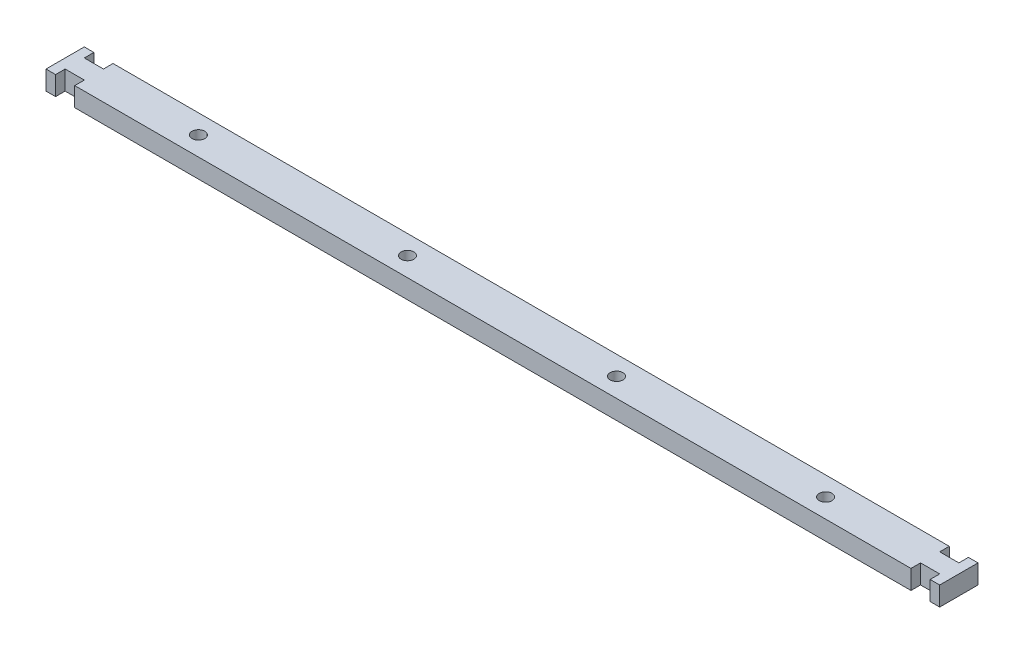
ISO-10303-21;
HEADER;
FILE_DESCRIPTION(('STEP AP214'),'2;1');
FILE_NAME('part.step','',(''),(''),'','','');
FILE_SCHEMA(('AUTOMOTIVE_DESIGN { 1 0 10303 214 1 1 1 1 }'));
ENDSEC;
DATA;
#1=APPLICATION_CONTEXT('core data for automotive mechanical design processes');
#2=APPLICATION_PROTOCOL_DEFINITION('international standard','automotive_design',2000,#1);
#3=PRODUCT_CONTEXT('',#1,'mechanical');
#4=PRODUCT('Part','Part','',(#3));
#5=PRODUCT_RELATED_PRODUCT_CATEGORY('part','',(#4));
#6=PRODUCT_DEFINITION_FORMATION('','',#4);
#7=PRODUCT_DEFINITION_CONTEXT('part definition',#1,'design');
#8=PRODUCT_DEFINITION('design','',#6,#7);
#9=PRODUCT_DEFINITION_SHAPE('','',#8);
#10=(LENGTH_UNIT() NAMED_UNIT(*) SI_UNIT(.MILLI.,.METRE.));
#11=(NAMED_UNIT(*) PLANE_ANGLE_UNIT() SI_UNIT($,.RADIAN.));
#12=(NAMED_UNIT(*) SI_UNIT($,.STERADIAN.) SOLID_ANGLE_UNIT());
#13=UNCERTAINTY_MEASURE_WITH_UNIT(LENGTH_MEASURE(1.E-05),#10,'distance_accuracy_value','');
#14=(GEOMETRIC_REPRESENTATION_CONTEXT(3) GLOBAL_UNCERTAINTY_ASSIGNED_CONTEXT((#13)) GLOBAL_UNIT_ASSIGNED_CONTEXT((#10,
#11,#12)) REPRESENTATION_CONTEXT('',''));
#15=CARTESIAN_POINT('',(0.,0.,0.));
#16=DIRECTION('',(0.,0.,1.));
#17=DIRECTION('',(1.,0.,0.));
#18=AXIS2_PLACEMENT_3D('',#15,#16,#17);
#19=CARTESIAN_POINT('',(0.,3.,0.));
#20=DIRECTION('',(0.,1.,0.));
#21=DIRECTION('',(0.,0.,1.));
#22=AXIS2_PLACEMENT_3D('',#19,#20,#21);
#23=PLANE('',#22);
#24=CARTESIAN_POINT('',(16.375,3.,0.));
#25=DIRECTION('',(0.,-1.,0.));
#26=DIRECTION('',(0.,0.,1.));
#27=AXIS2_PLACEMENT_3D('',#24,#25,#26);
#28=CIRCLE('',#27,1.);
#29=CARTESIAN_POINT('',(16.375,3.,1.));
#30=VERTEX_POINT('',#29);
#31=EDGE_CURVE('E685',#30,#30,#28,.T.);
#32=ORIENTED_EDGE('',*,*,#31,.T.);
#33=EDGE_LOOP('',(#32));
#34=FACE_BOUND('',#33,.T.);
#35=CARTESIAN_POINT('',(49.125,3.,0.));
#36=DIRECTION('',(0.,-1.,0.));
#37=DIRECTION('',(0.,0.,1.));
#38=AXIS2_PLACEMENT_3D('',#35,#36,#37);
#39=CIRCLE('',#38,0.999999999999998);
#40=CARTESIAN_POINT('',(49.125,3.,0.999999999999998));
#41=VERTEX_POINT('',#40);
#42=EDGE_CURVE('E670',#41,#41,#39,.T.);
#43=ORIENTED_EDGE('',*,*,#42,.T.);
#44=EDGE_LOOP('',(#43));
#45=FACE_BOUND('',#44,.T.);
#46=CARTESIAN_POINT('',(-16.375,3.,0.));
#47=DIRECTION('',(0.,1.,0.));
#48=DIRECTION('',(0.,0.,1.));
#49=AXIS2_PLACEMENT_3D('',#46,#47,#48);
#50=CIRCLE('',#49,1.);
#51=CARTESIAN_POINT('',(-16.375,3.,1.));
#52=VERTEX_POINT('',#51);
#53=EDGE_CURVE('E662',#52,#52,#50,.T.);
#54=ORIENTED_EDGE('',*,*,#53,.F.);
#55=EDGE_LOOP('',(#54));
#56=FACE_BOUND('',#55,.T.);
#57=CARTESIAN_POINT('',(-49.125,3.,0.));
#58=DIRECTION('',(0.,1.,0.));
#59=DIRECTION('',(0.,0.,1.));
#60=AXIS2_PLACEMENT_3D('',#57,#58,#59);
#61=CIRCLE('',#60,0.999999999999998);
#62=CARTESIAN_POINT('',(-49.125,3.,0.999999999999998));
#63=VERTEX_POINT('',#62);
#64=EDGE_CURVE('E667',#63,#63,#61,.T.);
#65=ORIENTED_EDGE('',*,*,#64,.F.);
#66=EDGE_LOOP('',(#65));
#67=FACE_BOUND('',#66,.T.);
#68=DIRECTION('',(-1.,0.,0.));
#69=VECTOR('',#68,1.);
#70=CARTESIAN_POINT('',(-68.5,3.,-3.));
#71=LINE('',#70,#69);
#72=CARTESIAN_POINT('',(65.5,3.,-3.));
#73=VERTEX_POINT('',#72);
#74=CARTESIAN_POINT('',(-65.5,3.,-3.));
#75=VERTEX_POINT('',#74);
#76=EDGE_CURVE('E65',#73,#75,#71,.T.);
#77=ORIENTED_EDGE('',*,*,#76,.T.);
#78=DIRECTION('',(0.,0.,1.));
#79=VECTOR('',#78,1.);
#80=CARTESIAN_POINT('',(-65.5,3.,-1.5));
#81=LINE('',#80,#79);
#82=CARTESIAN_POINT('',(-65.5,3.,-1.5));
#83=VERTEX_POINT('',#82);
#84=EDGE_CURVE('E278',#75,#83,#81,.T.);
#85=ORIENTED_EDGE('',*,*,#84,.T.);
#86=DIRECTION('',(-1.,0.,0.));
#87=VECTOR('',#86,1.);
#88=CARTESIAN_POINT('',(-68.5,3.,-1.5));
#89=LINE('',#88,#87);
#90=CARTESIAN_POINT('',(-68.5,3.,-1.5));
#91=VERTEX_POINT('',#90);
#92=EDGE_CURVE('E269',#83,#91,#89,.T.);
#93=ORIENTED_EDGE('',*,*,#92,.T.);
#94=DIRECTION('',(0.,0.,-1.));
#95=VECTOR('',#94,1.);
#96=CARTESIAN_POINT('',(-68.5,3.,0.));
#97=LINE('',#96,#95);
#98=CARTESIAN_POINT('',(-68.5,3.,-3.));
#99=VERTEX_POINT('',#98);
#100=EDGE_CURVE('E230',#91,#99,#97,.T.);
#101=ORIENTED_EDGE('',*,*,#100,.T.);
#102=DIRECTION('',(-1.,0.,0.));
#103=VECTOR('',#102,1.);
#104=CARTESIAN_POINT('',(0.,3.,-3.));
#105=LINE('',#104,#103);
#106=CARTESIAN_POINT('',(-70.,3.,-3.));
#107=VERTEX_POINT('',#106);
#108=EDGE_CURVE('E212',#99,#107,#105,.T.);
#109=ORIENTED_EDGE('',*,*,#108,.T.);
#110=DIRECTION('',(0.,0.,1.));
#111=VECTOR('',#110,1.);
#112=CARTESIAN_POINT('',(-70.,3.,0.));
#113=LINE('',#112,#111);
#114=CARTESIAN_POINT('',(-70.,3.,3.));
#115=VERTEX_POINT('',#114);
#116=EDGE_CURVE('E232',#107,#115,#113,.T.);
#117=ORIENTED_EDGE('',*,*,#116,.T.);
#118=DIRECTION('',(-1.,0.,0.));
#119=VECTOR('',#118,1.);
#120=CARTESIAN_POINT('',(0.,3.,3.));
#121=LINE('',#120,#119);
#122=CARTESIAN_POINT('',(-68.5,3.,3.));
#123=VERTEX_POINT('',#122);
#124=EDGE_CURVE('E205',#123,#115,#121,.T.);
#125=ORIENTED_EDGE('',*,*,#124,.F.);
#126=CARTESIAN_POINT('',(-68.5,3.,1.5));
#127=VERTEX_POINT('',#126);
#128=EDGE_CURVE('E227',#123,#127,#97,.T.);
#129=ORIENTED_EDGE('',*,*,#128,.T.);
#130=DIRECTION('',(-1.,0.,0.));
#131=VECTOR('',#130,1.);
#132=CARTESIAN_POINT('',(-68.5,3.,1.5));
#133=LINE('',#132,#131);
#134=CARTESIAN_POINT('',(-65.5,3.,1.5));
#135=VERTEX_POINT('',#134);
#136=EDGE_CURVE('E295',#135,#127,#133,.T.);
#137=ORIENTED_EDGE('',*,*,#136,.F.);
#138=DIRECTION('',(0.,0.,-1.));
#139=VECTOR('',#138,1.);
#140=CARTESIAN_POINT('',(-65.5,3.,1.5));
#141=LINE('',#140,#139);
#142=CARTESIAN_POINT('',(-65.5,3.,3.));
#143=VERTEX_POINT('',#142);
#144=EDGE_CURVE('E287',#143,#135,#141,.T.);
#145=ORIENTED_EDGE('',*,*,#144,.F.);
#146=DIRECTION('',(1.,0.,0.));
#147=VECTOR('',#146,1.);
#148=CARTESIAN_POINT('',(-68.5,3.,3.));
#149=LINE('',#148,#147);
#150=CARTESIAN_POINT('',(65.5,3.,3.));
#151=VERTEX_POINT('',#150);
#152=EDGE_CURVE('E12',#143,#151,#149,.T.);
#153=ORIENTED_EDGE('',*,*,#152,.T.);
#154=DIRECTION('',(0.,0.,-1.));
#155=VECTOR('',#154,1.);
#156=CARTESIAN_POINT('',(65.5,3.,1.5));
#157=LINE('',#156,#155);
#158=CARTESIAN_POINT('',(65.5,3.,1.5));
#159=VERTEX_POINT('',#158);
#160=EDGE_CURVE('E312',#151,#159,#157,.T.);
#161=ORIENTED_EDGE('',*,*,#160,.T.);
#162=DIRECTION('',(1.,0.,0.));
#163=VECTOR('',#162,1.);
#164=CARTESIAN_POINT('',(68.5,3.,1.5));
#165=LINE('',#164,#163);
#166=CARTESIAN_POINT('',(68.5,3.,1.5));
#167=VERTEX_POINT('',#166);
#168=EDGE_CURVE('E305',#159,#167,#165,.T.);
#169=ORIENTED_EDGE('',*,*,#168,.T.);
#170=DIRECTION('',(0.,0.,-1.));
#171=VECTOR('',#170,1.);
#172=CARTESIAN_POINT('',(68.5,3.,0.));
#173=LINE('',#172,#171);
#174=CARTESIAN_POINT('',(68.5,3.,3.));
#175=VERTEX_POINT('',#174);
#176=EDGE_CURVE('E255',#175,#167,#173,.T.);
#177=ORIENTED_EDGE('',*,*,#176,.F.);
#178=DIRECTION('',(1.,0.,0.));
#179=VECTOR('',#178,1.);
#180=CARTESIAN_POINT('',(0.,3.,3.));
#181=LINE('',#180,#179);
#182=CARTESIAN_POINT('',(70.,3.,3.));
#183=VERTEX_POINT('',#182);
#184=EDGE_CURVE('E258',#175,#183,#181,.T.);
#185=ORIENTED_EDGE('',*,*,#184,.T.);
#186=DIRECTION('',(0.,0.,1.));
#187=VECTOR('',#186,1.);
#188=CARTESIAN_POINT('',(70.,3.,0.));
#189=LINE('',#188,#187);
#190=CARTESIAN_POINT('',(70.,3.,-3.));
#191=VERTEX_POINT('',#190);
#192=EDGE_CURVE('E261',#191,#183,#189,.T.);
#193=ORIENTED_EDGE('',*,*,#192,.F.);
#194=DIRECTION('',(1.,0.,0.));
#195=VECTOR('',#194,1.);
#196=CARTESIAN_POINT('',(0.,3.,-3.));
#197=LINE('',#196,#195);
#198=CARTESIAN_POINT('',(68.5,3.,-3.));
#199=VERTEX_POINT('',#198);
#200=EDGE_CURVE('E264',#199,#191,#197,.T.);
#201=ORIENTED_EDGE('',*,*,#200,.F.);
#202=CARTESIAN_POINT('',(68.5,3.,-1.5));
#203=VERTEX_POINT('',#202);
#204=EDGE_CURVE('E239',#203,#199,#173,.T.);
#205=ORIENTED_EDGE('',*,*,#204,.F.);
#206=DIRECTION('',(1.,0.,0.));
#207=VECTOR('',#206,1.);
#208=CARTESIAN_POINT('',(68.5,3.,-1.5));
#209=LINE('',#208,#207);
#210=CARTESIAN_POINT('',(65.5,3.,-1.5));
#211=VERTEX_POINT('',#210);
#212=EDGE_CURVE('E329',#211,#203,#209,.T.);
#213=ORIENTED_EDGE('',*,*,#212,.F.);
#214=DIRECTION('',(0.,0.,1.));
#215=VECTOR('',#214,1.);
#216=CARTESIAN_POINT('',(65.5,3.,-1.5));
#217=LINE('',#216,#215);
#218=EDGE_CURVE('E322',#73,#211,#217,.T.);
#219=ORIENTED_EDGE('',*,*,#218,.F.);
#220=EDGE_LOOP('',(#77,#85,#93,#101,#109,#117,#125,#129,#137,#145,#153,#161,#169,#177,#185,#193,
#201,#205,#213,#219));
#221=FACE_BOUND('',#220,.T.);
#222=ADVANCED_FACE('F56',(#34,#45,#56,#67,#221),#23,.T.);
#223=CARTESIAN_POINT('',(0.,0.,0.));
#224=DIRECTION('',(0.,1.,0.));
#225=DIRECTION('',(0.,0.,1.));
#226=AXIS2_PLACEMENT_3D('',#223,#224,#225);
#227=PLANE('',#226);
#228=CARTESIAN_POINT('',(16.375,0.,0.));
#229=DIRECTION('',(0.,-1.,0.));
#230=DIRECTION('',(0.,0.,1.));
#231=AXIS2_PLACEMENT_3D('',#228,#229,#230);
#232=CIRCLE('',#231,1.);
#233=CARTESIAN_POINT('',(16.375,0.,1.));
#234=VERTEX_POINT('',#233);
#235=EDGE_CURVE('E683',#234,#234,#232,.T.);
#236=ORIENTED_EDGE('',*,*,#235,.F.);
#237=EDGE_LOOP('',(#236));
#238=FACE_BOUND('',#237,.T.);
#239=CARTESIAN_POINT('',(49.125,0.,0.));
#240=DIRECTION('',(0.,-1.,0.));
#241=DIRECTION('',(0.,0.,1.));
#242=AXIS2_PLACEMENT_3D('',#239,#240,#241);
#243=CIRCLE('',#242,0.999999999999998);
#244=CARTESIAN_POINT('',(49.125,0.,0.999999999999998));
#245=VERTEX_POINT('',#244);
#246=EDGE_CURVE('E676',#245,#245,#243,.T.);
#247=ORIENTED_EDGE('',*,*,#246,.F.);
#248=EDGE_LOOP('',(#247));
#249=FACE_BOUND('',#248,.T.);
#250=CARTESIAN_POINT('',(-16.375,0.,0.));
#251=DIRECTION('',(0.,1.,0.));
#252=DIRECTION('',(0.,0.,1.));
#253=AXIS2_PLACEMENT_3D('',#250,#251,#252);
#254=CIRCLE('',#253,1.);
#255=CARTESIAN_POINT('',(-16.375,0.,1.));
#256=VERTEX_POINT('',#255);
#257=EDGE_CURVE('E660',#256,#256,#254,.T.);
#258=ORIENTED_EDGE('',*,*,#257,.T.);
#259=EDGE_LOOP('',(#258));
#260=FACE_BOUND('',#259,.T.);
#261=CARTESIAN_POINT('',(-49.125,0.,0.));
#262=DIRECTION('',(0.,1.,0.));
#263=DIRECTION('',(0.,0.,1.));
#264=AXIS2_PLACEMENT_3D('',#261,#262,#263);
#265=CIRCLE('',#264,0.999999999999998);
#266=CARTESIAN_POINT('',(-49.125,0.,0.999999999999998));
#267=VERTEX_POINT('',#266);
#268=EDGE_CURVE('E674',#267,#267,#265,.T.);
#269=ORIENTED_EDGE('',*,*,#268,.T.);
#270=EDGE_LOOP('',(#269));
#271=FACE_BOUND('',#270,.T.);
#272=DIRECTION('',(0.,0.,1.));
#273=VECTOR('',#272,1.);
#274=CARTESIAN_POINT('',(-65.5,0.,-1.5));
#275=LINE('',#274,#273);
#276=CARTESIAN_POINT('',(-65.5,0.,-3.));
#277=VERTEX_POINT('',#276);
#278=CARTESIAN_POINT('',(-65.5,0.,-1.5));
#279=VERTEX_POINT('',#278);
#280=EDGE_CURVE('E277',#277,#279,#275,.T.);
#281=ORIENTED_EDGE('',*,*,#280,.F.);
#282=DIRECTION('',(-1.,0.,0.));
#283=VECTOR('',#282,1.);
#284=CARTESIAN_POINT('',(-68.5,0.,-3.));
#285=LINE('',#284,#283);
#286=CARTESIAN_POINT('',(65.5,0.,-3.));
#287=VERTEX_POINT('',#286);
#288=EDGE_CURVE('E339',#287,#277,#285,.T.);
#289=ORIENTED_EDGE('',*,*,#288,.F.);
#290=DIRECTION('',(0.,0.,1.));
#291=VECTOR('',#290,1.);
#292=CARTESIAN_POINT('',(65.5,0.,-1.5));
#293=LINE('',#292,#291);
#294=CARTESIAN_POINT('',(65.5,0.,-1.5));
#295=VERTEX_POINT('',#294);
#296=EDGE_CURVE('E325',#287,#295,#293,.T.);
#297=ORIENTED_EDGE('',*,*,#296,.T.);
#298=DIRECTION('',(1.,0.,0.));
#299=VECTOR('',#298,1.);
#300=CARTESIAN_POINT('',(68.5,0.,-1.5));
#301=LINE('',#300,#299);
#302=CARTESIAN_POINT('',(68.5,0.,-1.5));
#303=VERTEX_POINT('',#302);
#304=EDGE_CURVE('E328',#295,#303,#301,.T.);
#305=ORIENTED_EDGE('',*,*,#304,.T.);
#306=DIRECTION('',(0.,0.,-1.));
#307=VECTOR('',#306,1.);
#308=CARTESIAN_POINT('',(68.5,0.,0.));
#309=LINE('',#308,#307);
#310=CARTESIAN_POINT('',(68.5,0.,-3.));
#311=VERTEX_POINT('',#310);
#312=EDGE_CURVE('E247',#303,#311,#309,.T.);
#313=ORIENTED_EDGE('',*,*,#312,.T.);
#314=DIRECTION('',(1.,0.,0.));
#315=VECTOR('',#314,1.);
#316=CARTESIAN_POINT('',(0.,0.,-3.));
#317=LINE('',#316,#315);
#318=CARTESIAN_POINT('',(70.,0.,-3.));
#319=VERTEX_POINT('',#318);
#320=EDGE_CURVE('E252',#311,#319,#317,.T.);
#321=ORIENTED_EDGE('',*,*,#320,.T.);
#322=DIRECTION('',(0.,0.,1.));
#323=VECTOR('',#322,1.);
#324=CARTESIAN_POINT('',(70.,0.,0.));
#325=LINE('',#324,#323);
#326=CARTESIAN_POINT('',(70.,0.,3.));
#327=VERTEX_POINT('',#326);
#328=EDGE_CURVE('E250',#319,#327,#325,.T.);
#329=ORIENTED_EDGE('',*,*,#328,.T.);
#330=DIRECTION('',(1.,0.,0.));
#331=VECTOR('',#330,1.);
#332=CARTESIAN_POINT('',(0.,0.,3.));
#333=LINE('',#332,#331);
#334=CARTESIAN_POINT('',(68.5,0.,3.));
#335=VERTEX_POINT('',#334);
#336=EDGE_CURVE('E246',#335,#327,#333,.T.);
#337=ORIENTED_EDGE('',*,*,#336,.F.);
#338=CARTESIAN_POINT('',(68.5,0.,1.5));
#339=VERTEX_POINT('',#338);
#340=EDGE_CURVE('E243',#335,#339,#309,.T.);
#341=ORIENTED_EDGE('',*,*,#340,.T.);
#342=DIRECTION('',(1.,0.,0.));
#343=VECTOR('',#342,1.);
#344=CARTESIAN_POINT('',(68.5,0.,1.5));
#345=LINE('',#344,#343);
#346=CARTESIAN_POINT('',(65.5,0.,1.5));
#347=VERTEX_POINT('',#346);
#348=EDGE_CURVE('E309',#347,#339,#345,.T.);
#349=ORIENTED_EDGE('',*,*,#348,.F.);
#350=DIRECTION('',(0.,0.,-1.));
#351=VECTOR('',#350,1.);
#352=CARTESIAN_POINT('',(65.5,0.,1.5));
#353=LINE('',#352,#351);
#354=CARTESIAN_POINT('',(65.5,0.,3.));
#355=VERTEX_POINT('',#354);
#356=EDGE_CURVE('E311',#355,#347,#353,.T.);
#357=ORIENTED_EDGE('',*,*,#356,.F.);
#358=DIRECTION('',(1.,0.,0.));
#359=VECTOR('',#358,1.);
#360=CARTESIAN_POINT('',(-68.5,0.,3.));
#361=LINE('',#360,#359);
#362=CARTESIAN_POINT('',(-65.5,0.,3.));
#363=VERTEX_POINT('',#362);
#364=EDGE_CURVE('E60',#363,#355,#361,.T.);
#365=ORIENTED_EDGE('',*,*,#364,.F.);
#366=DIRECTION('',(0.,0.,-1.));
#367=VECTOR('',#366,1.);
#368=CARTESIAN_POINT('',(-65.5,0.,1.5));
#369=LINE('',#368,#367);
#370=CARTESIAN_POINT('',(-65.5,0.,1.5));
#371=VERTEX_POINT('',#370);
#372=EDGE_CURVE('E291',#363,#371,#369,.T.);
#373=ORIENTED_EDGE('',*,*,#372,.T.);
#374=DIRECTION('',(-1.,0.,0.));
#375=VECTOR('',#374,1.);
#376=CARTESIAN_POINT('',(-68.5,0.,1.5));
#377=LINE('',#376,#375);
#378=CARTESIAN_POINT('',(-68.5,0.,1.5));
#379=VERTEX_POINT('',#378);
#380=EDGE_CURVE('E294',#371,#379,#377,.T.);
#381=ORIENTED_EDGE('',*,*,#380,.T.);
#382=DIRECTION('',(0.,0.,-1.));
#383=VECTOR('',#382,1.);
#384=CARTESIAN_POINT('',(-68.5,0.,0.));
#385=LINE('',#384,#383);
#386=CARTESIAN_POINT('',(-68.5,0.,3.));
#387=VERTEX_POINT('',#386);
#388=EDGE_CURVE('E204',#387,#379,#385,.T.);
#389=ORIENTED_EDGE('',*,*,#388,.F.);
#390=DIRECTION('',(-1.,0.,0.));
#391=VECTOR('',#390,1.);
#392=CARTESIAN_POINT('',(0.,0.,3.));
#393=LINE('',#392,#391);
#394=CARTESIAN_POINT('',(-70.,0.,3.));
#395=VERTEX_POINT('',#394);
#396=EDGE_CURVE('E214',#387,#395,#393,.T.);
#397=ORIENTED_EDGE('',*,*,#396,.T.);
#398=DIRECTION('',(0.,0.,1.));
#399=VECTOR('',#398,1.);
#400=CARTESIAN_POINT('',(-70.,0.,0.));
#401=LINE('',#400,#399);
#402=CARTESIAN_POINT('',(-70.,0.,-3.));
#403=VERTEX_POINT('',#402);
#404=EDGE_CURVE('E220',#403,#395,#401,.T.);
#405=ORIENTED_EDGE('',*,*,#404,.F.);
#406=DIRECTION('',(-1.,0.,0.));
#407=VECTOR('',#406,1.);
#408=CARTESIAN_POINT('',(0.,0.,-3.));
#409=LINE('',#408,#407);
#410=CARTESIAN_POINT('',(-68.5,0.,-3.));
#411=VERTEX_POINT('',#410);
#412=EDGE_CURVE('E210',#411,#403,#409,.T.);
#413=ORIENTED_EDGE('',*,*,#412,.F.);
#414=CARTESIAN_POINT('',(-68.5,0.,-1.5));
#415=VERTEX_POINT('',#414);
#416=EDGE_CURVE('E195',#415,#411,#385,.T.);
#417=ORIENTED_EDGE('',*,*,#416,.F.);
#418=DIRECTION('',(-1.,0.,0.));
#419=VECTOR('',#418,1.);
#420=CARTESIAN_POINT('',(-68.5,0.,-1.5));
#421=LINE('',#420,#419);
#422=EDGE_CURVE('E73',#279,#415,#421,.T.);
#423=ORIENTED_EDGE('',*,*,#422,.F.);
#424=EDGE_LOOP('',(#281,#289,#297,#305,#313,#321,#329,#337,#341,#349,#357,#365,#373,#381,#389,
#397,#405,#413,#417,#423));
#425=FACE_BOUND('',#424,.T.);
#426=ADVANCED_FACE('F218',(#238,#249,#260,#271,#425),#227,.F.);
#427=CARTESIAN_POINT('',(-68.5,3.,-3.));
#428=DIRECTION('',(0.,0.,1.));
#429=DIRECTION('',(1.,0.,0.));
#430=AXIS2_PLACEMENT_3D('',#427,#428,#429);
#431=PLANE('',#430);
#432=DIRECTION('',(0.,1.,0.));
#433=VECTOR('',#432,1.);
#434=CARTESIAN_POINT('',(-65.5,0.,-3.));
#435=LINE('',#434,#433);
#436=EDGE_CURVE('E284',#277,#75,#435,.T.);
#437=ORIENTED_EDGE('',*,*,#436,.T.);
#438=ORIENTED_EDGE('',*,*,#76,.F.);
#439=DIRECTION('',(0.,1.,0.));
#440=VECTOR('',#439,1.);
#441=CARTESIAN_POINT('',(65.5,0.,-3.));
#442=LINE('',#441,#440);
#443=EDGE_CURVE('E332',#287,#73,#442,.T.);
#444=ORIENTED_EDGE('',*,*,#443,.F.);
#445=ORIENTED_EDGE('',*,*,#288,.T.);
#446=EDGE_LOOP('',(#437,#438,#444,#445));
#447=FACE_BOUND('',#446,.T.);
#448=ADVANCED_FACE('F58',(#447),#431,.F.);
#449=CARTESIAN_POINT('',(-68.5,3.,3.));
#450=DIRECTION('',(0.,0.,-1.));
#451=DIRECTION('',(-1.,0.,0.));
#452=AXIS2_PLACEMENT_3D('',#449,#450,#451);
#453=PLANE('',#452);
#454=ORIENTED_EDGE('',*,*,#152,.F.);
#455=DIRECTION('',(0.,1.,0.));
#456=VECTOR('',#455,1.);
#457=CARTESIAN_POINT('',(-65.5,0.,3.));
#458=LINE('',#457,#456);
#459=EDGE_CURVE('E298',#363,#143,#458,.T.);
#460=ORIENTED_EDGE('',*,*,#459,.F.);
#461=ORIENTED_EDGE('',*,*,#364,.T.);
#462=DIRECTION('',(0.,1.,0.));
#463=VECTOR('',#462,1.);
#464=CARTESIAN_POINT('',(65.5,0.,3.));
#465=LINE('',#464,#463);
#466=EDGE_CURVE('E319',#355,#151,#465,.T.);
#467=ORIENTED_EDGE('',*,*,#466,.T.);
#468=EDGE_LOOP('',(#454,#460,#461,#467));
#469=FACE_BOUND('',#468,.T.);
#470=ADVANCED_FACE('F353',(#469),#453,.F.);
#471=CARTESIAN_POINT('',(68.5,0.,-1.5));
#472=DIRECTION('',(0.,0.,1.));
#473=DIRECTION('',(1.,0.,0.));
#474=AXIS2_PLACEMENT_3D('',#471,#472,#473);
#475=PLANE('',#474);
#476=ORIENTED_EDGE('',*,*,#212,.T.);
#477=DIRECTION('',(0.,1.,0.));
#478=VECTOR('',#477,1.);
#479=CARTESIAN_POINT('',(68.5,0.,-1.5));
#480=LINE('',#479,#478);
#481=EDGE_CURVE('E336',#303,#203,#480,.T.);
#482=ORIENTED_EDGE('',*,*,#481,.F.);
#483=ORIENTED_EDGE('',*,*,#304,.F.);
#484=DIRECTION('',(0.,1.,0.));
#485=VECTOR('',#484,1.);
#486=CARTESIAN_POINT('',(65.5,0.,-1.5));
#487=LINE('',#486,#485);
#488=EDGE_CURVE('E340',#295,#211,#487,.T.);
#489=ORIENTED_EDGE('',*,*,#488,.T.);
#490=EDGE_LOOP('',(#476,#482,#483,#489));
#491=FACE_BOUND('',#490,.T.);
#492=ADVANCED_FACE('F387',(#491),#475,.F.);
#493=CARTESIAN_POINT('',(65.5,0.,-1.5));
#494=DIRECTION('',(-1.,0.,0.));
#495=DIRECTION('',(0.,0.,1.));
#496=AXIS2_PLACEMENT_3D('',#493,#494,#495);
#497=PLANE('',#496);
#498=ORIENTED_EDGE('',*,*,#218,.T.);
#499=ORIENTED_EDGE('',*,*,#488,.F.);
#500=ORIENTED_EDGE('',*,*,#296,.F.);
#501=ORIENTED_EDGE('',*,*,#443,.T.);
#502=EDGE_LOOP('',(#498,#499,#500,#501));
#503=FACE_BOUND('',#502,.T.);
#504=ADVANCED_FACE('F390',(#503),#497,.F.);
#505=CARTESIAN_POINT('',(65.5,0.,1.5));
#506=DIRECTION('',(1.,0.,0.));
#507=DIRECTION('',(0.,0.,-1.));
#508=AXIS2_PLACEMENT_3D('',#505,#506,#507);
#509=PLANE('',#508);
#510=ORIENTED_EDGE('',*,*,#160,.F.);
#511=ORIENTED_EDGE('',*,*,#466,.F.);
#512=ORIENTED_EDGE('',*,*,#356,.T.);
#513=DIRECTION('',(0.,1.,0.));
#514=VECTOR('',#513,1.);
#515=CARTESIAN_POINT('',(65.5,0.,1.5));
#516=LINE('',#515,#514);
#517=EDGE_CURVE('E81',#347,#159,#516,.T.);
#518=ORIENTED_EDGE('',*,*,#517,.T.);
#519=EDGE_LOOP('',(#510,#511,#512,#518));
#520=FACE_BOUND('',#519,.T.);
#521=ADVANCED_FACE('F357',(#520),#509,.T.);
#522=CARTESIAN_POINT('',(68.5,0.,1.5));
#523=DIRECTION('',(0.,0.,1.));
#524=DIRECTION('',(1.,0.,0.));
#525=AXIS2_PLACEMENT_3D('',#522,#523,#524);
#526=PLANE('',#525);
#527=ORIENTED_EDGE('',*,*,#168,.F.);
#528=ORIENTED_EDGE('',*,*,#517,.F.);
#529=ORIENTED_EDGE('',*,*,#348,.T.);
#530=DIRECTION('',(0.,1.,0.));
#531=VECTOR('',#530,1.);
#532=CARTESIAN_POINT('',(68.5,0.,1.5));
#533=LINE('',#532,#531);
#534=EDGE_CURVE('E314',#339,#167,#533,.T.);
#535=ORIENTED_EDGE('',*,*,#534,.T.);
#536=EDGE_LOOP('',(#527,#528,#529,#535));
#537=FACE_BOUND('',#536,.T.);
#538=ADVANCED_FACE('F362',(#537),#526,.T.);
#539=CARTESIAN_POINT('',(-68.5,0.,1.5));
#540=DIRECTION('',(0.,0.,-1.));
#541=DIRECTION('',(-1.,0.,0.));
#542=AXIS2_PLACEMENT_3D('',#539,#540,#541);
#543=PLANE('',#542);
#544=ORIENTED_EDGE('',*,*,#136,.T.);
#545=DIRECTION('',(0.,1.,0.));
#546=VECTOR('',#545,1.);
#547=CARTESIAN_POINT('',(-68.5,0.,1.5));
#548=LINE('',#547,#546);
#549=EDGE_CURVE('E302',#379,#127,#548,.T.);
#550=ORIENTED_EDGE('',*,*,#549,.F.);
#551=ORIENTED_EDGE('',*,*,#380,.F.);
#552=DIRECTION('',(0.,1.,0.));
#553=VECTOR('',#552,1.);
#554=CARTESIAN_POINT('',(-65.5,0.,1.5));
#555=LINE('',#554,#553);
#556=EDGE_CURVE('E306',#371,#135,#555,.T.);
#557=ORIENTED_EDGE('',*,*,#556,.T.);
#558=EDGE_LOOP('',(#544,#550,#551,#557));
#559=FACE_BOUND('',#558,.T.);
#560=ADVANCED_FACE('F466',(#559),#543,.F.);
#561=CARTESIAN_POINT('',(-65.5,0.,1.5));
#562=DIRECTION('',(1.,0.,0.));
#563=DIRECTION('',(0.,0.,-1.));
#564=AXIS2_PLACEMENT_3D('',#561,#562,#563);
#565=PLANE('',#564);
#566=ORIENTED_EDGE('',*,*,#144,.T.);
#567=ORIENTED_EDGE('',*,*,#556,.F.);
#568=ORIENTED_EDGE('',*,*,#372,.F.);
#569=ORIENTED_EDGE('',*,*,#459,.T.);
#570=EDGE_LOOP('',(#566,#567,#568,#569));
#571=FACE_BOUND('',#570,.T.);
#572=ADVANCED_FACE('F404',(#571),#565,.F.);
#573=CARTESIAN_POINT('',(-65.5,0.,-1.5));
#574=DIRECTION('',(-1.,0.,0.));
#575=DIRECTION('',(0.,0.,1.));
#576=AXIS2_PLACEMENT_3D('',#573,#574,#575);
#577=PLANE('',#576);
#578=ORIENTED_EDGE('',*,*,#84,.F.);
#579=ORIENTED_EDGE('',*,*,#436,.F.);
#580=ORIENTED_EDGE('',*,*,#280,.T.);
#581=DIRECTION('',(0.,1.,0.));
#582=VECTOR('',#581,1.);
#583=CARTESIAN_POINT('',(-65.5,0.,-1.5));
#584=LINE('',#583,#582);
#585=EDGE_CURVE('E288',#279,#83,#584,.T.);
#586=ORIENTED_EDGE('',*,*,#585,.T.);
#587=EDGE_LOOP('',(#578,#579,#580,#586));
#588=FACE_BOUND('',#587,.T.);
#589=ADVANCED_FACE('F395',(#588),#577,.T.);
#590=CARTESIAN_POINT('',(-68.5,0.,-1.5));
#591=DIRECTION('',(0.,0.,-1.));
#592=DIRECTION('',(-1.,0.,0.));
#593=AXIS2_PLACEMENT_3D('',#590,#591,#592);
#594=PLANE('',#593);
#595=ORIENTED_EDGE('',*,*,#92,.F.);
#596=ORIENTED_EDGE('',*,*,#585,.F.);
#597=ORIENTED_EDGE('',*,*,#422,.T.);
#598=DIRECTION('',(0.,1.,0.));
#599=VECTOR('',#598,1.);
#600=CARTESIAN_POINT('',(-68.5,0.,-1.5));
#601=LINE('',#600,#599);
#602=EDGE_CURVE('E201',#415,#91,#601,.T.);
#603=ORIENTED_EDGE('',*,*,#602,.T.);
#604=EDGE_LOOP('',(#595,#596,#597,#603));
#605=FACE_BOUND('',#604,.T.);
#606=ADVANCED_FACE('F396',(#605),#594,.T.);
#607=CARTESIAN_POINT('',(68.5,0.,0.));
#608=DIRECTION('',(1.,0.,0.));
#609=DIRECTION('',(0.,0.,-1.));
#610=AXIS2_PLACEMENT_3D('',#607,#608,#609);
#611=PLANE('',#610);
#612=ORIENTED_EDGE('',*,*,#312,.F.);
#613=ORIENTED_EDGE('',*,*,#481,.T.);
#614=ORIENTED_EDGE('',*,*,#204,.T.);
#615=DIRECTION('',(0.,1.,0.));
#616=VECTOR('',#615,1.);
#617=CARTESIAN_POINT('',(68.5,0.,-3.));
#618=LINE('',#617,#616);
#619=EDGE_CURVE('E266',#311,#199,#618,.T.);
#620=ORIENTED_EDGE('',*,*,#619,.F.);
#621=EDGE_LOOP('',(#612,#613,#614,#620));
#622=FACE_BOUND('',#621,.T.);
#623=ADVANCED_FACE('F385',(#622),#611,.F.);
#624=ORIENTED_EDGE('',*,*,#534,.F.);
#625=ORIENTED_EDGE('',*,*,#340,.F.);
#626=DIRECTION('',(0.,1.,0.));
#627=VECTOR('',#626,1.);
#628=CARTESIAN_POINT('',(68.5,0.,3.));
#629=LINE('',#628,#627);
#630=EDGE_CURVE('E254',#335,#175,#629,.T.);
#631=ORIENTED_EDGE('',*,*,#630,.T.);
#632=ORIENTED_EDGE('',*,*,#176,.T.);
#633=EDGE_LOOP('',(#624,#625,#631,#632));
#634=FACE_BOUND('',#633,.T.);
#635=ADVANCED_FACE('F364',(#634),#611,.F.);
#636=CARTESIAN_POINT('',(0.,0.,-3.));
#637=DIRECTION('',(0.,0.,1.));
#638=DIRECTION('',(1.,0.,0.));
#639=AXIS2_PLACEMENT_3D('',#636,#637,#638);
#640=PLANE('',#639);
#641=ORIENTED_EDGE('',*,*,#200,.T.);
#642=DIRECTION('',(0.,1.,0.));
#643=VECTOR('',#642,1.);
#644=CARTESIAN_POINT('',(70.,0.,-3.));
#645=LINE('',#644,#643);
#646=EDGE_CURVE('E270',#319,#191,#645,.T.);
#647=ORIENTED_EDGE('',*,*,#646,.F.);
#648=ORIENTED_EDGE('',*,*,#320,.F.);
#649=ORIENTED_EDGE('',*,*,#619,.T.);
#650=EDGE_LOOP('',(#641,#647,#648,#649));
#651=FACE_BOUND('',#650,.T.);
#652=ADVANCED_FACE('F382',(#651),#640,.F.);
#653=CARTESIAN_POINT('',(70.,0.,0.));
#654=DIRECTION('',(-1.,0.,0.));
#655=DIRECTION('',(0.,0.,1.));
#656=AXIS2_PLACEMENT_3D('',#653,#654,#655);
#657=PLANE('',#656);
#658=ORIENTED_EDGE('',*,*,#192,.T.);
#659=DIRECTION('',(0.,1.,0.));
#660=VECTOR('',#659,1.);
#661=CARTESIAN_POINT('',(70.,0.,3.));
#662=LINE('',#661,#660);
#663=EDGE_CURVE('E273',#327,#183,#662,.T.);
#664=ORIENTED_EDGE('',*,*,#663,.F.);
#665=ORIENTED_EDGE('',*,*,#328,.F.);
#666=ORIENTED_EDGE('',*,*,#646,.T.);
#667=EDGE_LOOP('',(#658,#664,#665,#666));
#668=FACE_BOUND('',#667,.T.);
#669=ADVANCED_FACE('F374',(#668),#657,.F.);
#670=CARTESIAN_POINT('',(0.,0.,3.));
#671=DIRECTION('',(0.,0.,1.));
#672=DIRECTION('',(1.,0.,0.));
#673=AXIS2_PLACEMENT_3D('',#670,#671,#672);
#674=PLANE('',#673);
#675=ORIENTED_EDGE('',*,*,#184,.F.);
#676=ORIENTED_EDGE('',*,*,#630,.F.);
#677=ORIENTED_EDGE('',*,*,#336,.T.);
#678=ORIENTED_EDGE('',*,*,#663,.T.);
#679=EDGE_LOOP('',(#675,#676,#677,#678));
#680=FACE_BOUND('',#679,.T.);
#681=ADVANCED_FACE('F370',(#680),#674,.T.);
#682=CARTESIAN_POINT('',(-68.5,0.,0.));
#683=DIRECTION('',(1.,0.,0.));
#684=DIRECTION('',(0.,0.,-1.));
#685=AXIS2_PLACEMENT_3D('',#682,#683,#684);
#686=PLANE('',#685);
#687=ORIENTED_EDGE('',*,*,#602,.F.);
#688=ORIENTED_EDGE('',*,*,#416,.T.);
#689=DIRECTION('',(0.,1.,0.));
#690=VECTOR('',#689,1.);
#691=CARTESIAN_POINT('',(-68.5,0.,-3.));
#692=LINE('',#691,#690);
#693=EDGE_CURVE('E199',#411,#99,#692,.T.);
#694=ORIENTED_EDGE('',*,*,#693,.T.);
#695=ORIENTED_EDGE('',*,*,#100,.F.);
#696=EDGE_LOOP('',(#687,#688,#694,#695));
#697=FACE_BOUND('',#696,.T.);
#698=ADVANCED_FACE('F197',(#697),#686,.T.);
#699=ORIENTED_EDGE('',*,*,#388,.T.);
#700=ORIENTED_EDGE('',*,*,#549,.T.);
#701=ORIENTED_EDGE('',*,*,#128,.F.);
#702=DIRECTION('',(0.,1.,0.));
#703=VECTOR('',#702,1.);
#704=CARTESIAN_POINT('',(-68.5,0.,3.));
#705=LINE('',#704,#703);
#706=EDGE_CURVE('E237',#387,#123,#705,.T.);
#707=ORIENTED_EDGE('',*,*,#706,.F.);
#708=EDGE_LOOP('',(#699,#700,#701,#707));
#709=FACE_BOUND('',#708,.T.);
#710=ADVANCED_FACE('F485',(#709),#686,.T.);
#711=CARTESIAN_POINT('',(0.,0.,3.));
#712=DIRECTION('',(0.,0.,-1.));
#713=DIRECTION('',(-1.,0.,0.));
#714=AXIS2_PLACEMENT_3D('',#711,#712,#713);
#715=PLANE('',#714);
#716=ORIENTED_EDGE('',*,*,#124,.T.);
#717=DIRECTION('',(0.,1.,0.));
#718=VECTOR('',#717,1.);
#719=CARTESIAN_POINT('',(-70.,0.,3.));
#720=LINE('',#719,#718);
#721=EDGE_CURVE('E240',#395,#115,#720,.T.);
#722=ORIENTED_EDGE('',*,*,#721,.F.);
#723=ORIENTED_EDGE('',*,*,#396,.F.);
#724=ORIENTED_EDGE('',*,*,#706,.T.);
#725=EDGE_LOOP('',(#716,#722,#723,#724));
#726=FACE_BOUND('',#725,.T.);
#727=ADVANCED_FACE('F496',(#726),#715,.F.);
#728=CARTESIAN_POINT('',(-70.,0.,0.));
#729=DIRECTION('',(-1.,0.,0.));
#730=DIRECTION('',(0.,0.,1.));
#731=AXIS2_PLACEMENT_3D('',#728,#729,#730);
#732=PLANE('',#731);
#733=ORIENTED_EDGE('',*,*,#116,.F.);
#734=DIRECTION('',(0.,1.,0.));
#735=VECTOR('',#734,1.);
#736=CARTESIAN_POINT('',(-70.,0.,-3.));
#737=LINE('',#736,#735);
#738=EDGE_CURVE('E213',#403,#107,#737,.T.);
#739=ORIENTED_EDGE('',*,*,#738,.F.);
#740=ORIENTED_EDGE('',*,*,#404,.T.);
#741=ORIENTED_EDGE('',*,*,#721,.T.);
#742=EDGE_LOOP('',(#733,#739,#740,#741));
#743=FACE_BOUND('',#742,.T.);
#744=ADVANCED_FACE('F507',(#743),#732,.T.);
#745=CARTESIAN_POINT('',(0.,0.,-3.));
#746=DIRECTION('',(0.,0.,-1.));
#747=DIRECTION('',(-1.,0.,0.));
#748=AXIS2_PLACEMENT_3D('',#745,#746,#747);
#749=PLANE('',#748);
#750=ORIENTED_EDGE('',*,*,#108,.F.);
#751=ORIENTED_EDGE('',*,*,#693,.F.);
#752=ORIENTED_EDGE('',*,*,#412,.T.);
#753=ORIENTED_EDGE('',*,*,#738,.T.);
#754=EDGE_LOOP('',(#750,#751,#752,#753));
#755=FACE_BOUND('',#754,.T.);
#756=ADVANCED_FACE('F209',(#755),#749,.T.);
#757=CARTESIAN_POINT('',(-49.125,0.,0.));
#758=DIRECTION('',(0.,1.,0.));
#759=DIRECTION('',(0.,0.,1.));
#760=AXIS2_PLACEMENT_3D('',#757,#758,#759);
#761=CYLINDRICAL_SURFACE('',#760,0.999999999999998);
#762=ORIENTED_EDGE('',*,*,#64,.T.);
#763=EDGE_LOOP('',(#762));
#764=FACE_BOUND('',#763,.T.);
#765=ORIENTED_EDGE('',*,*,#268,.F.);
#766=EDGE_LOOP('',(#765));
#767=FACE_BOUND('',#766,.T.);
#768=ADVANCED_FACE('F527',(#764,#767),#761,.F.);
#769=CARTESIAN_POINT('',(-16.375,0.,0.));
#770=DIRECTION('',(0.,1.,0.));
#771=DIRECTION('',(0.,0.,1.));
#772=AXIS2_PLACEMENT_3D('',#769,#770,#771);
#773=CYLINDRICAL_SURFACE('',#772,1.);
#774=ORIENTED_EDGE('',*,*,#257,.F.);
#775=EDGE_LOOP('',(#774));
#776=FACE_BOUND('',#775,.T.);
#777=ORIENTED_EDGE('',*,*,#53,.T.);
#778=EDGE_LOOP('',(#777));
#779=FACE_BOUND('',#778,.T.);
#780=ADVANCED_FACE('F536',(#776,#779),#773,.F.);
#781=CARTESIAN_POINT('',(49.125,0.,0.));
#782=DIRECTION('',(0.,1.,0.));
#783=DIRECTION('',(0.,0.,1.));
#784=AXIS2_PLACEMENT_3D('',#781,#782,#783);
#785=CYLINDRICAL_SURFACE('',#784,0.999999999999998);
#786=ORIENTED_EDGE('',*,*,#42,.F.);
#787=EDGE_LOOP('',(#786));
#788=FACE_BOUND('',#787,.T.);
#789=ORIENTED_EDGE('',*,*,#246,.T.);
#790=EDGE_LOOP('',(#789));
#791=FACE_BOUND('',#790,.T.);
#792=ADVANCED_FACE('F545',(#788,#791),#785,.F.);
#793=CARTESIAN_POINT('',(16.375,0.,0.));
#794=DIRECTION('',(0.,1.,0.));
#795=DIRECTION('',(0.,0.,1.));
#796=AXIS2_PLACEMENT_3D('',#793,#794,#795);
#797=CYLINDRICAL_SURFACE('',#796,1.);
#798=ORIENTED_EDGE('',*,*,#235,.T.);
#799=EDGE_LOOP('',(#798));
#800=FACE_BOUND('',#799,.T.);
#801=ORIENTED_EDGE('',*,*,#31,.F.);
#802=EDGE_LOOP('',(#801));
#803=FACE_BOUND('',#802,.T.);
#804=ADVANCED_FACE('F555',(#800,#803),#797,.F.);
#805=CLOSED_SHELL('',(#222,#426,#448,#470,#492,#504,#521,#538,#560,#572,#589,#606,#623,#635,
#652,#669,#681,#698,#710,#727,#744,#756,#768,#780,#792,#804));
#806=MANIFOLD_SOLID_BREP('B2',#805);
#807=ADVANCED_BREP_SHAPE_REPRESENTATION('',(#18,#806),#14);
#808=SHAPE_DEFINITION_REPRESENTATION(#9,#807);
ENDSEC;
END-ISO-10303-21;
